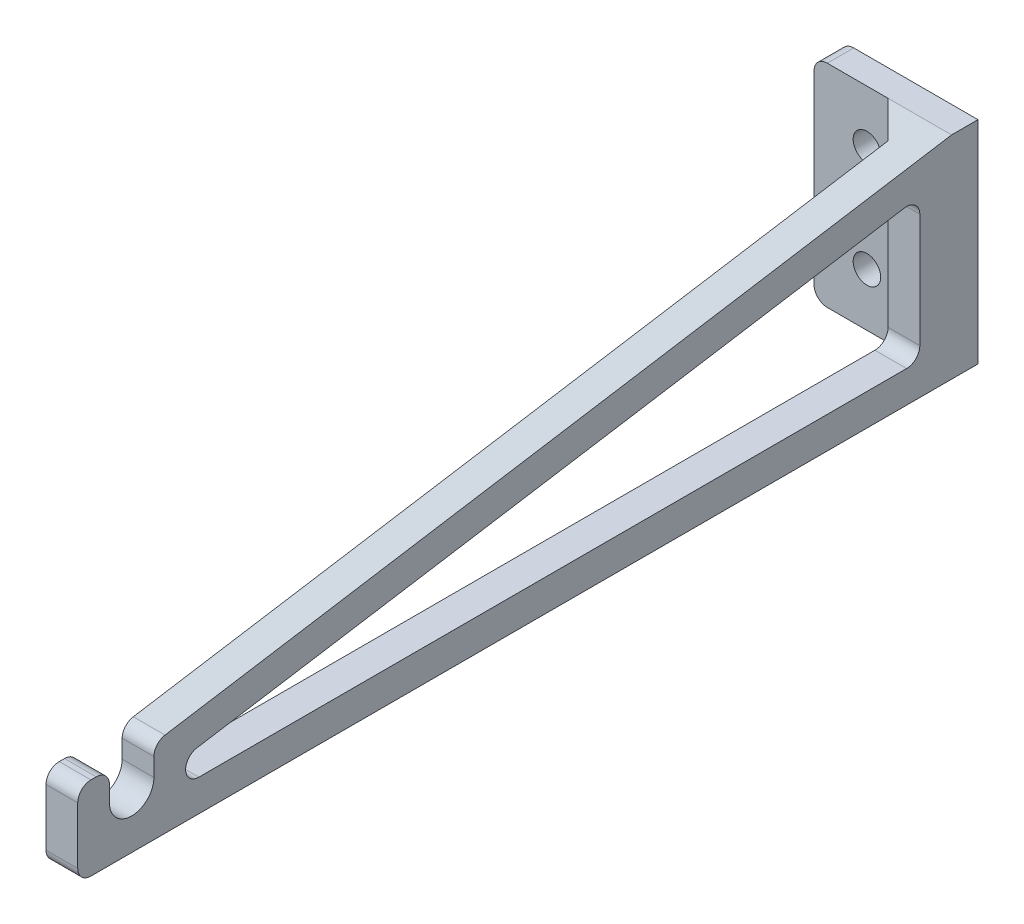
ISO-10303-21;
HEADER;
FILE_DESCRIPTION(('STEP AP214'),'2;1');
FILE_NAME('part.step','',(''),(''),'','','');
FILE_SCHEMA(('AUTOMOTIVE_DESIGN { 1 0 10303 214 1 1 1 1 }'));
ENDSEC;
DATA;
#1=APPLICATION_CONTEXT('core data for automotive mechanical design processes');
#2=APPLICATION_PROTOCOL_DEFINITION('international standard','automotive_design',2000,#1);
#3=PRODUCT_CONTEXT('',#1,'mechanical');
#4=PRODUCT('Part','Part','',(#3));
#5=PRODUCT_RELATED_PRODUCT_CATEGORY('part','',(#4));
#6=PRODUCT_DEFINITION_FORMATION('','',#4);
#7=PRODUCT_DEFINITION_CONTEXT('part definition',#1,'design');
#8=PRODUCT_DEFINITION('design','',#6,#7);
#9=PRODUCT_DEFINITION_SHAPE('','',#8);
#10=(LENGTH_UNIT() NAMED_UNIT(*) SI_UNIT(.MILLI.,.METRE.));
#11=(NAMED_UNIT(*) PLANE_ANGLE_UNIT() SI_UNIT($,.RADIAN.));
#12=(NAMED_UNIT(*) SI_UNIT($,.STERADIAN.) SOLID_ANGLE_UNIT());
#13=UNCERTAINTY_MEASURE_WITH_UNIT(LENGTH_MEASURE(1.E-05),#10,'distance_accuracy_value','');
#14=(GEOMETRIC_REPRESENTATION_CONTEXT(3) GLOBAL_UNCERTAINTY_ASSIGNED_CONTEXT((#13)) GLOBAL_UNIT_ASSIGNED_CONTEXT((#10,
#11,#12)) REPRESENTATION_CONTEXT('',''));
#15=CARTESIAN_POINT('',(0.,0.,0.));
#16=DIRECTION('',(0.,0.,1.));
#17=DIRECTION('',(1.,0.,0.));
#18=AXIS2_PLACEMENT_3D('',#15,#16,#17);
#19=CARTESIAN_POINT('',(-6.00000000000002,0.,5.));
#20=DIRECTION('',(-0.707106781186544,0.,0.707106781186551));
#21=DIRECTION('',(0.,1.,0.));
#22=AXIS2_PLACEMENT_3D('',#19,#20,#21);
#23=PLANE('',#22);
#24=CARTESIAN_POINT('',(-10.,10.,1.00000000000006));
#25=DIRECTION('',(0.707106781186544,0.,-0.707106781186551));
#26=DIRECTION('',(-0.707106781186551,0.,-0.707106781186544));
#27=AXIS2_PLACEMENT_3D('',#24,#25,#26);
#28=ELLIPSE('',#27,7.07106781186544,5.);
#29=CARTESIAN_POINT('',(-6.00000000000002,13.,5.));
#30=VERTEX_POINT('',#29);
#31=CARTESIAN_POINT('',(-6.00000000000002,6.99999999999998,5.));
#32=VERTEX_POINT('',#31);
#33=EDGE_CURVE('E11',#30,#32,#28,.T.);
#34=ORIENTED_EDGE('',*,*,#33,.T.);
#35=DIRECTION('',(0.,-1.,0.));
#36=VECTOR('',#35,1.);
#37=CARTESIAN_POINT('',(-6.00000000000002,0.,5.));
#38=LINE('',#37,#36);
#39=CARTESIAN_POINT('',(-6.00000000000002,0.,5.));
#40=VERTEX_POINT('',#39);
#41=EDGE_CURVE('E239',#32,#40,#38,.T.);
#42=ORIENTED_EDGE('',*,*,#41,.T.);
#43=DIRECTION('',(-0.707106781186551,0.,-0.707106781186544));
#44=VECTOR('',#43,1.);
#45=CARTESIAN_POINT('',(-2.99999999999998,0.,8.00000000000001));
#46=LINE('',#45,#44);
#47=CARTESIAN_POINT('',(0.,0.,11.));
#48=VERTEX_POINT('',#47);
#49=EDGE_CURVE('E608',#40,#48,#46,.F.);
#50=ORIENTED_EDGE('',*,*,#49,.T.);
#51=DIRECTION('',(0.,1.,0.));
#52=VECTOR('',#51,1.);
#53=CARTESIAN_POINT('',(0.,40.,11.));
#54=LINE('',#53,#52);
#55=CARTESIAN_POINT('',(0.,8.5,11.));
#56=VERTEX_POINT('',#55);
#57=EDGE_CURVE('E242',#48,#56,#54,.T.);
#58=ORIENTED_EDGE('',*,*,#57,.T.);
#59=DIRECTION('',(0.,-1.,0.));
#60=VECTOR('',#59,1.);
#61=CARTESIAN_POINT('',(0.,6.,11.));
#62=LINE('',#61,#60);
#63=CARTESIAN_POINT('',(0.,30.0239709974199,11.));
#64=VERTEX_POINT('',#63);
#65=EDGE_CURVE('E499',#64,#56,#62,.T.);
#66=ORIENTED_EDGE('',*,*,#65,.F.);
#67=DIRECTION('',(0.,1.,0.));
#68=VECTOR('',#67,1.);
#69=CARTESIAN_POINT('',(0.,40.,11.));
#70=LINE('',#69,#68);
#71=CARTESIAN_POINT('',(0.,39.035175879397,11.));
#72=VERTEX_POINT('',#71);
#73=EDGE_CURVE('E237',#64,#72,#70,.T.);
#74=ORIENTED_EDGE('',*,*,#73,.T.);
#75=DIRECTION('',(0.702579553550976,-0.112977616651412,0.702579553550968));
#76=VECTOR('',#75,1.);
#77=CARTESIAN_POINT('',(-0.0765836511853451,39.0474908383816,10.9234163488146));
#78=LINE('',#77,#76);
#79=CARTESIAN_POINT('',(-6.00000000000002,40.,5.));
#80=VERTEX_POINT('',#79);
#81=EDGE_CURVE('E233',#72,#80,#78,.F.);
#82=ORIENTED_EDGE('',*,*,#81,.T.);
#83=CARTESIAN_POINT('',(-6.00000000000002,33.,5.));
#84=VERTEX_POINT('',#83);
#85=EDGE_CURVE('E223',#80,#84,#38,.T.);
#86=ORIENTED_EDGE('',*,*,#85,.T.);
#87=CARTESIAN_POINT('',(-10.,30.,1.00000000000006));
#88=DIRECTION('',(0.707106781186544,0.,-0.707106781186551));
#89=DIRECTION('',(-0.707106781186551,0.,-0.707106781186544));
#90=AXIS2_PLACEMENT_3D('',#87,#88,#89);
#91=ELLIPSE('',#90,7.07106781186544,5.);
#92=CARTESIAN_POINT('',(-6.00000000000002,27.,5.));
#93=VERTEX_POINT('',#92);
#94=EDGE_CURVE('E46',#84,#93,#91,.T.);
#95=ORIENTED_EDGE('',*,*,#94,.T.);
#96=EDGE_CURVE('E226',#93,#30,#38,.T.);
#97=ORIENTED_EDGE('',*,*,#96,.T.);
#98=EDGE_LOOP('',(#34,#42,#50,#58,#66,#74,#82,#86,#95,#97));
#99=FACE_BOUND('',#98,.T.);
#100=ADVANCED_FACE('F38',(#99),#23,.T.);
#101=CARTESIAN_POINT('',(0.,0.,5.));
#102=DIRECTION('',(0.,1.,0.));
#103=DIRECTION('',(0.,0.,1.));
#104=AXIS2_PLACEMENT_3D('',#101,#102,#103);
#105=PLANE('',#104);
#106=DIRECTION('',(-1.,0.,0.));
#107=VECTOR('',#106,1.);
#108=CARTESIAN_POINT('',(0.,0.,0.));
#109=LINE('',#108,#107);
#110=CARTESIAN_POINT('',(6.,0.,0.));
#111=VERTEX_POINT('',#110);
#112=CARTESIAN_POINT('',(-17.5,0.,0.));
#113=VERTEX_POINT('',#112);
#114=EDGE_CURVE('E401',#111,#113,#109,.T.);
#115=ORIENTED_EDGE('',*,*,#114,.F.);
#116=DIRECTION('',(0.,0.,1.));
#117=VECTOR('',#116,1.);
#118=CARTESIAN_POINT('',(6.,0.,0.));
#119=LINE('',#118,#117);
#120=CARTESIAN_POINT('',(6.,0.,167.7));
#121=VERTEX_POINT('',#120);
#122=EDGE_CURVE('E428',#111,#121,#119,.T.);
#123=ORIENTED_EDGE('',*,*,#122,.T.);
#124=DIRECTION('',(-1.,0.,0.));
#125=VECTOR('',#124,1.);
#126=CARTESIAN_POINT('',(0.,0.,167.7));
#127=LINE('',#126,#125);
#128=CARTESIAN_POINT('',(0.,0.,167.7));
#129=VERTEX_POINT('',#128);
#130=EDGE_CURVE('E373',#129,#121,#127,.F.);
#131=ORIENTED_EDGE('',*,*,#130,.F.);
#132=DIRECTION('',(0.,0.,1.));
#133=VECTOR('',#132,1.);
#134=CARTESIAN_POINT('',(0.,0.,0.));
#135=LINE('',#134,#133);
#136=EDGE_CURVE('E449',#48,#129,#135,.T.);
#137=ORIENTED_EDGE('',*,*,#136,.F.);
#138=ORIENTED_EDGE('',*,*,#49,.F.);
#139=DIRECTION('',(-1.,0.,0.));
#140=VECTOR('',#139,1.);
#141=CARTESIAN_POINT('',(0.,0.,5.));
#142=LINE('',#141,#140);
#143=CARTESIAN_POINT('',(-17.5,0.,5.));
#144=VERTEX_POINT('',#143);
#145=EDGE_CURVE('E396',#40,#144,#142,.T.);
#146=ORIENTED_EDGE('',*,*,#145,.T.);
#147=DIRECTION('',(0.,0.,-1.));
#148=VECTOR('',#147,1.);
#149=CARTESIAN_POINT('',(-17.5,0.,5.));
#150=LINE('',#149,#148);
#151=EDGE_CURVE('E369',#113,#144,#150,.F.);
#152=ORIENTED_EDGE('',*,*,#151,.F.);
#153=EDGE_LOOP('',(#115,#123,#131,#137,#138,#146,#152));
#154=FACE_BOUND('',#153,.T.);
#155=ADVANCED_FACE('F567',(#154),#105,.F.);
#156=CARTESIAN_POINT('',(-20.,0.,5.));
#157=DIRECTION('',(1.,0.,0.));
#158=DIRECTION('',(0.,0.,1.));
#159=AXIS2_PLACEMENT_3D('',#156,#157,#158);
#160=PLANE('',#159);
#161=DIRECTION('',(0.,1.,0.));
#162=VECTOR('',#161,1.);
#163=CARTESIAN_POINT('',(-20.,0.,5.));
#164=LINE('',#163,#162);
#165=CARTESIAN_POINT('',(-20.,2.5,5.));
#166=VERTEX_POINT('',#165);
#167=CARTESIAN_POINT('',(-20.,37.5,5.));
#168=VERTEX_POINT('',#167);
#169=EDGE_CURVE('E409',#166,#168,#164,.T.);
#170=ORIENTED_EDGE('',*,*,#169,.T.);
#171=DIRECTION('',(0.,0.,-1.));
#172=VECTOR('',#171,1.);
#173=CARTESIAN_POINT('',(-20.,37.5,5.));
#174=LINE('',#173,#172);
#175=CARTESIAN_POINT('',(-20.,37.5,0.));
#176=VERTEX_POINT('',#175);
#177=EDGE_CURVE('E387',#176,#168,#174,.F.);
#178=ORIENTED_EDGE('',*,*,#177,.F.);
#179=DIRECTION('',(0.,1.,0.));
#180=VECTOR('',#179,1.);
#181=CARTESIAN_POINT('',(-20.,0.,0.));
#182=LINE('',#181,#180);
#183=CARTESIAN_POINT('',(-20.,2.5,0.));
#184=VERTEX_POINT('',#183);
#185=EDGE_CURVE('E397',#184,#176,#182,.T.);
#186=ORIENTED_EDGE('',*,*,#185,.F.);
#187=DIRECTION('',(0.,0.,-1.));
#188=VECTOR('',#187,1.);
#189=CARTESIAN_POINT('',(-20.,2.5,5.));
#190=LINE('',#189,#188);
#191=EDGE_CURVE('E383',#166,#184,#190,.T.);
#192=ORIENTED_EDGE('',*,*,#191,.F.);
#193=EDGE_LOOP('',(#170,#178,#186,#192));
#194=FACE_BOUND('',#193,.T.);
#195=ADVANCED_FACE('F549',(#194),#160,.F.);
#196=CARTESIAN_POINT('',(0.,40.,5.));
#197=DIRECTION('',(0.,-1.,0.));
#198=DIRECTION('',(0.,0.,-1.));
#199=AXIS2_PLACEMENT_3D('',#196,#197,#198);
#200=PLANE('',#199);
#201=DIRECTION('',(1.,0.,0.));
#202=VECTOR('',#201,1.);
#203=CARTESIAN_POINT('',(0.,40.,5.));
#204=LINE('',#203,#202);
#205=CARTESIAN_POINT('',(-17.5,40.,5.));
#206=VERTEX_POINT('',#205);
#207=EDGE_CURVE('E391',#206,#80,#204,.T.);
#208=ORIENTED_EDGE('',*,*,#207,.T.);
#209=DIRECTION('',(-1.,0.,0.));
#210=VECTOR('',#209,1.);
#211=CARTESIAN_POINT('',(6.,40.,5.));
#212=LINE('',#211,#210);
#213=CARTESIAN_POINT('',(6.,40.,5.));
#214=VERTEX_POINT('',#213);
#215=EDGE_CURVE('E421',#214,#80,#212,.T.);
#216=ORIENTED_EDGE('',*,*,#215,.F.);
#217=DIRECTION('',(0.,0.,-1.));
#218=VECTOR('',#217,1.);
#219=CARTESIAN_POINT('',(6.,40.,5.));
#220=LINE('',#219,#218);
#221=CARTESIAN_POINT('',(6.,40.,0.));
#222=VERTEX_POINT('',#221);
#223=EDGE_CURVE('E456',#214,#222,#220,.T.);
#224=ORIENTED_EDGE('',*,*,#223,.T.);
#225=DIRECTION('',(1.,0.,0.));
#226=VECTOR('',#225,1.);
#227=CARTESIAN_POINT('',(0.,40.,0.));
#228=LINE('',#227,#226);
#229=CARTESIAN_POINT('',(-17.5,40.,0.));
#230=VERTEX_POINT('',#229);
#231=EDGE_CURVE('E392',#230,#222,#228,.T.);
#232=ORIENTED_EDGE('',*,*,#231,.F.);
#233=DIRECTION('',(0.,0.,-1.));
#234=VECTOR('',#233,1.);
#235=CARTESIAN_POINT('',(-17.5,40.,5.));
#236=LINE('',#235,#234);
#237=EDGE_CURVE('E283',#206,#230,#236,.T.);
#238=ORIENTED_EDGE('',*,*,#237,.F.);
#239=EDGE_LOOP('',(#208,#216,#224,#232,#238));
#240=FACE_BOUND('',#239,.T.);
#241=ADVANCED_FACE('F556',(#240),#200,.F.);
#242=CARTESIAN_POINT('',(0.,0.,5.));
#243=DIRECTION('',(0.,0.,-1.));
#244=DIRECTION('',(1.,0.,0.));
#245=AXIS2_PLACEMENT_3D('',#242,#243,#244);
#246=PLANE('',#245);
#247=ORIENTED_EDGE('',*,*,#96,.F.);
#248=CARTESIAN_POINT('',(-10.,30.,5.));
#249=DIRECTION('',(0.,0.,-1.));
#250=DIRECTION('',(-1.,0.,0.));
#251=AXIS2_PLACEMENT_3D('',#248,#249,#250);
#252=CIRCLE('',#251,5.);
#253=EDGE_CURVE('E59',#84,#93,#252,.T.);
#254=ORIENTED_EDGE('',*,*,#253,.F.);
#255=ORIENTED_EDGE('',*,*,#85,.F.);
#256=ORIENTED_EDGE('',*,*,#207,.F.);
#257=CARTESIAN_POINT('',(-17.5,37.5,5.));
#258=DIRECTION('',(0.,0.,1.));
#259=DIRECTION('',(1.,0.,0.));
#260=AXIS2_PLACEMENT_3D('',#257,#258,#259);
#261=CIRCLE('',#260,2.5);
#262=EDGE_CURVE('E366',#168,#206,#261,.F.);
#263=ORIENTED_EDGE('',*,*,#262,.F.);
#264=ORIENTED_EDGE('',*,*,#169,.F.);
#265=CARTESIAN_POINT('',(-17.5,2.5,5.));
#266=DIRECTION('',(0.,0.,1.));
#267=DIRECTION('',(1.,0.,0.));
#268=AXIS2_PLACEMENT_3D('',#265,#266,#267);
#269=CIRCLE('',#268,2.5);
#270=EDGE_CURVE('E363',#144,#166,#269,.F.);
#271=ORIENTED_EDGE('',*,*,#270,.F.);
#272=ORIENTED_EDGE('',*,*,#145,.F.);
#273=ORIENTED_EDGE('',*,*,#41,.F.);
#274=CARTESIAN_POINT('',(-10.,10.,5.));
#275=DIRECTION('',(0.,0.,-1.));
#276=DIRECTION('',(-1.,0.,0.));
#277=AXIS2_PLACEMENT_3D('',#274,#275,#276);
#278=CIRCLE('',#277,5.);
#279=EDGE_CURVE('E52',#30,#32,#278,.T.);
#280=ORIENTED_EDGE('',*,*,#279,.F.);
#281=EDGE_LOOP('',(#247,#254,#255,#256,#263,#264,#271,#272,#273,#280));
#282=FACE_BOUND('',#281,.T.);
#283=CARTESIAN_POINT('',(-10.,30.,5.));
#284=DIRECTION('',(0.,0.,-1.));
#285=DIRECTION('',(-1.,0.,0.));
#286=AXIS2_PLACEMENT_3D('',#283,#284,#285);
#287=CIRCLE('',#286,2.6);
#288=CARTESIAN_POINT('',(-12.6,30.,5.));
#289=VERTEX_POINT('',#288);
#290=EDGE_CURVE('E525',#289,#289,#287,.T.);
#291=ORIENTED_EDGE('',*,*,#290,.T.);
#292=EDGE_LOOP('',(#291));
#293=FACE_BOUND('',#292,.T.);
#294=CARTESIAN_POINT('',(-10.,10.,5.));
#295=DIRECTION('',(0.,0.,-1.));
#296=DIRECTION('',(-1.,0.,0.));
#297=AXIS2_PLACEMENT_3D('',#294,#295,#296);
#298=CIRCLE('',#297,2.6);
#299=CARTESIAN_POINT('',(-12.6,10.,5.));
#300=VERTEX_POINT('',#299);
#301=EDGE_CURVE('E517',#300,#300,#298,.T.);
#302=ORIENTED_EDGE('',*,*,#301,.T.);
#303=EDGE_LOOP('',(#302));
#304=FACE_BOUND('',#303,.T.);
#305=ADVANCED_FACE('F219',(#282,#293,#304),#246,.F.);
#306=CARTESIAN_POINT('',(0.,0.,0.));
#307=DIRECTION('',(0.,0.,-1.));
#308=DIRECTION('',(1.,0.,0.));
#309=AXIS2_PLACEMENT_3D('',#306,#307,#308);
#310=PLANE('',#309);
#311=CARTESIAN_POINT('',(-10.,30.,0.));
#312=DIRECTION('',(0.,0.,-1.));
#313=DIRECTION('',(-1.,0.,0.));
#314=AXIS2_PLACEMENT_3D('',#311,#312,#313);
#315=CIRCLE('',#314,2.6);
#316=CARTESIAN_POINT('',(-12.6,30.,0.));
#317=VERTEX_POINT('',#316);
#318=EDGE_CURVE('E503',#317,#317,#315,.T.);
#319=ORIENTED_EDGE('',*,*,#318,.F.);
#320=EDGE_LOOP('',(#319));
#321=FACE_BOUND('',#320,.T.);
#322=CARTESIAN_POINT('',(-10.,10.,0.));
#323=DIRECTION('',(0.,0.,-1.));
#324=DIRECTION('',(-1.,0.,0.));
#325=AXIS2_PLACEMENT_3D('',#322,#323,#324);
#326=CIRCLE('',#325,2.6);
#327=CARTESIAN_POINT('',(-12.6,10.,0.));
#328=VERTEX_POINT('',#327);
#329=EDGE_CURVE('E521',#328,#328,#326,.T.);
#330=ORIENTED_EDGE('',*,*,#329,.F.);
#331=EDGE_LOOP('',(#330));
#332=FACE_BOUND('',#331,.T.);
#333=ORIENTED_EDGE('',*,*,#185,.T.);
#334=CARTESIAN_POINT('',(-17.5,37.5,0.));
#335=DIRECTION('',(0.,0.,1.));
#336=DIRECTION('',(1.,0.,0.));
#337=AXIS2_PLACEMENT_3D('',#334,#335,#336);
#338=CIRCLE('',#337,2.5);
#339=EDGE_CURVE('E380',#230,#176,#338,.T.);
#340=ORIENTED_EDGE('',*,*,#339,.F.);
#341=ORIENTED_EDGE('',*,*,#231,.T.);
#342=DIRECTION('',(0.,-1.,0.));
#343=VECTOR('',#342,1.);
#344=CARTESIAN_POINT('',(6.,40.,0.));
#345=LINE('',#344,#343);
#346=EDGE_CURVE('E424',#222,#111,#345,.T.);
#347=ORIENTED_EDGE('',*,*,#346,.T.);
#348=ORIENTED_EDGE('',*,*,#114,.T.);
#349=CARTESIAN_POINT('',(-17.5,2.5,0.));
#350=DIRECTION('',(0.,0.,1.));
#351=DIRECTION('',(1.,0.,0.));
#352=AXIS2_PLACEMENT_3D('',#349,#350,#351);
#353=CIRCLE('',#352,2.5);
#354=EDGE_CURVE('E377',#184,#113,#353,.T.);
#355=ORIENTED_EDGE('',*,*,#354,.F.);
#356=EDGE_LOOP('',(#333,#340,#341,#347,#348,#355));
#357=FACE_BOUND('',#356,.T.);
#358=ADVANCED_FACE('F538',(#321,#332,#357),#310,.T.);
#359=CARTESIAN_POINT('',(6.,10.2,160.));
#360=DIRECTION('',(1.,0.,0.));
#361=DIRECTION('',(0.,0.,1.));
#362=AXIS2_PLACEMENT_3D('',#359,#360,#361);
#363=PLANE('',#362);
#364=DIRECTION('',(0.,1.,0.));
#365=VECTOR('',#364,1.);
#366=CARTESIAN_POINT('',(6.,15.7507537688442,170.2));
#367=LINE('',#366,#365);
#368=CARTESIAN_POINT('',(6.,2.50000000000001,170.2));
#369=VERTEX_POINT('',#368);
#370=CARTESIAN_POINT('',(6.,13.2507537688442,170.2));
#371=VERTEX_POINT('',#370);
#372=EDGE_CURVE('E479',#369,#371,#367,.T.);
#373=ORIENTED_EDGE('',*,*,#372,.F.);
#374=CARTESIAN_POINT('',(6.,2.5,167.7));
#375=DIRECTION('',(-1.,0.,0.));
#376=DIRECTION('',(0.,0.,1.));
#377=AXIS2_PLACEMENT_3D('',#374,#375,#376);
#378=CIRCLE('',#377,2.5);
#379=EDGE_CURVE('E332',#121,#369,#378,.T.);
#380=ORIENTED_EDGE('',*,*,#379,.F.);
#381=ORIENTED_EDGE('',*,*,#122,.F.);
#382=ORIENTED_EDGE('',*,*,#346,.F.);
#383=ORIENTED_EDGE('',*,*,#223,.F.);
#384=DIRECTION('',(0.,0.158764460274187,-0.987316487330099));
#385=VECTOR('',#384,1.);
#386=CARTESIAN_POINT('',(6.,40.,5.));
#387=LINE('',#386,#385);
#388=CARTESIAN_POINT('',(6.,16.0889389104425,153.696911150685));
#389=VERTEX_POINT('',#388);
#390=EDGE_CURVE('E460',#389,#214,#387,.T.);
#391=ORIENTED_EDGE('',*,*,#390,.F.);
#392=CARTESIAN_POINT('',(6.,13.6206476921173,153.3));
#393=DIRECTION('',(-1.,0.,0.));
#394=DIRECTION('',(0.,0.,1.));
#395=AXIS2_PLACEMENT_3D('',#392,#393,#394);
#396=CIRCLE('',#395,2.5);
#397=CARTESIAN_POINT('',(6.,13.6206476921173,155.8));
#398=VERTEX_POINT('',#397);
#399=EDGE_CURVE('E328',#398,#389,#396,.T.);
#400=ORIENTED_EDGE('',*,*,#399,.F.);
#401=DIRECTION('',(0.,1.,0.));
#402=VECTOR('',#401,1.);
#403=CARTESIAN_POINT('',(6.,10.2,155.8));
#404=LINE('',#403,#402);
#405=CARTESIAN_POINT('',(6.,10.2,155.8));
#406=VERTEX_POINT('',#405);
#407=EDGE_CURVE('E463',#406,#398,#404,.T.);
#408=ORIENTED_EDGE('',*,*,#407,.F.);
#409=CARTESIAN_POINT('',(6.,10.2,160.));
#410=DIRECTION('',(1.,0.,0.));
#411=DIRECTION('',(0.,0.,1.));
#412=AXIS2_PLACEMENT_3D('',#409,#410,#411);
#413=CIRCLE('',#412,4.20000000000001);
#414=CARTESIAN_POINT('',(6.,10.2,164.2));
#415=VERTEX_POINT('',#414);
#416=EDGE_CURVE('E467',#415,#406,#413,.T.);
#417=ORIENTED_EDGE('',*,*,#416,.F.);
#418=DIRECTION('',(0.,-1.,0.));
#419=VECTOR('',#418,1.);
#420=CARTESIAN_POINT('',(6.,10.2,164.2));
#421=LINE('',#420,#419);
#422=CARTESIAN_POINT('',(6.,13.2507537688442,164.2));
#423=VERTEX_POINT('',#422);
#424=EDGE_CURVE('E471',#423,#415,#421,.T.);
#425=ORIENTED_EDGE('',*,*,#424,.F.);
#426=CARTESIAN_POINT('',(6.,13.2507537688442,166.7));
#427=DIRECTION('',(-1.,0.,0.));
#428=DIRECTION('',(0.,0.,1.));
#429=AXIS2_PLACEMENT_3D('',#426,#427,#428);
#430=CIRCLE('',#429,2.5);
#431=CARTESIAN_POINT('',(6.,15.7507537688442,166.7));
#432=VERTEX_POINT('',#431);
#433=EDGE_CURVE('E324',#432,#423,#430,.T.);
#434=ORIENTED_EDGE('',*,*,#433,.F.);
#435=DIRECTION('',(0.,0.,-1.));
#436=VECTOR('',#435,1.);
#437=CARTESIAN_POINT('',(6.,15.7507537688442,164.2));
#438=LINE('',#437,#436);
#439=CARTESIAN_POINT('',(6.,15.7507537688442,167.7));
#440=VERTEX_POINT('',#439);
#441=EDGE_CURVE('E475',#440,#432,#438,.T.);
#442=ORIENTED_EDGE('',*,*,#441,.F.);
#443=CARTESIAN_POINT('',(6.,13.2507537688442,167.7));
#444=DIRECTION('',(-1.,0.,0.));
#445=DIRECTION('',(0.,0.,1.));
#446=AXIS2_PLACEMENT_3D('',#443,#444,#445);
#447=CIRCLE('',#446,2.5);
#448=EDGE_CURVE('E320',#371,#440,#447,.T.);
#449=ORIENTED_EDGE('',*,*,#448,.F.);
#450=EDGE_LOOP('',(#373,#380,#381,#382,#383,#391,#400,#408,#417,#425,#434,#442,#449));
#451=FACE_BOUND('',#450,.T.);
#452=DIRECTION('',(0.,0.,1.));
#453=VECTOR('',#452,1.);
#454=CARTESIAN_POINT('',(6.,6.,11.));
#455=LINE('',#454,#453);
#456=CARTESIAN_POINT('',(6.,6.,13.5));
#457=VERTEX_POINT('',#456);
#458=CARTESIAN_POINT('',(6.,6.,147.3));
#459=VERTEX_POINT('',#458);
#460=EDGE_CURVE('E510',#457,#459,#455,.T.);
#461=ORIENTED_EDGE('',*,*,#460,.T.);
#462=CARTESIAN_POINT('',(6.,8.5,147.3));
#463=DIRECTION('',(-1.,0.,0.));
#464=DIRECTION('',(0.,0.,1.));
#465=AXIS2_PLACEMENT_3D('',#462,#463,#464);
#466=CIRCLE('',#465,2.5);
#467=CARTESIAN_POINT('',(6.,8.5,149.8));
#468=VERTEX_POINT('',#467);
#469=EDGE_CURVE('E257',#468,#459,#466,.F.);
#470=ORIENTED_EDGE('',*,*,#469,.F.);
#471=DIRECTION('',(0.,1.,0.));
#472=VECTOR('',#471,1.);
#473=CARTESIAN_POINT('',(6.,6.,149.8));
#474=LINE('',#473,#472);
#475=CARTESIAN_POINT('',(6.,8.50839310797267,149.8));
#476=VERTEX_POINT('',#475);
#477=EDGE_CURVE('E507',#468,#476,#474,.T.);
#478=ORIENTED_EDGE('',*,*,#477,.T.);
#479=CARTESIAN_POINT('',(6.,8.50839310797267,147.3));
#480=DIRECTION('',(-1.,0.,0.));
#481=DIRECTION('',(0.,0.,1.));
#482=AXIS2_PLACEMENT_3D('',#479,#480,#481);
#483=CIRCLE('',#482,2.5);
#484=CARTESIAN_POINT('',(6.,10.9766843262979,147.696911150685));
#485=VERTEX_POINT('',#484);
#486=EDGE_CURVE('E247',#485,#476,#483,.F.);
#487=ORIENTED_EDGE('',*,*,#486,.F.);
#488=DIRECTION('',(0.,0.158764460274187,-0.987316487330099));
#489=VECTOR('',#488,1.);
#490=CARTESIAN_POINT('',(6.,10.6384991846996,149.8));
#491=LINE('',#490,#489);
#492=CARTESIAN_POINT('',(6.,32.4922622157451,13.8969111506855));
#493=VERTEX_POINT('',#492);
#494=EDGE_CURVE('E453',#485,#493,#491,.T.);
#495=ORIENTED_EDGE('',*,*,#494,.T.);
#496=CARTESIAN_POINT('',(6.,30.0239709974199,13.5));
#497=DIRECTION('',(-1.,0.,0.));
#498=DIRECTION('',(0.,0.,1.));
#499=AXIS2_PLACEMENT_3D('',#496,#497,#498);
#500=CIRCLE('',#499,2.5);
#501=CARTESIAN_POINT('',(6.,30.0239709974199,11.));
#502=VERTEX_POINT('',#501);
#503=EDGE_CURVE('E275',#502,#493,#500,.F.);
#504=ORIENTED_EDGE('',*,*,#503,.F.);
#505=DIRECTION('',(0.,-1.,0.));
#506=VECTOR('',#505,1.);
#507=CARTESIAN_POINT('',(6.,6.,11.));
#508=LINE('',#507,#506);
#509=CARTESIAN_POINT('',(6.,8.5,11.));
#510=VERTEX_POINT('',#509);
#511=EDGE_CURVE('E490',#502,#510,#508,.T.);
#512=ORIENTED_EDGE('',*,*,#511,.T.);
#513=CARTESIAN_POINT('',(6.,8.5,13.5));
#514=DIRECTION('',(-1.,0.,0.));
#515=DIRECTION('',(0.,0.,1.));
#516=AXIS2_PLACEMENT_3D('',#513,#514,#515);
#517=CIRCLE('',#516,2.5);
#518=EDGE_CURVE('E267',#457,#510,#517,.F.);
#519=ORIENTED_EDGE('',*,*,#518,.F.);
#520=EDGE_LOOP('',(#461,#470,#478,#487,#495,#504,#512,#519));
#521=FACE_BOUND('',#520,.T.);
#522=ADVANCED_FACE('F541',(#451,#521),#363,.T.);
#523=CARTESIAN_POINT('',(0.,10.2,160.));
#524=DIRECTION('',(1.,0.,0.));
#525=DIRECTION('',(0.,0.,1.));
#526=AXIS2_PLACEMENT_3D('',#523,#524,#525);
#527=PLANE('',#526);
#528=ORIENTED_EDGE('',*,*,#136,.T.);
#529=CARTESIAN_POINT('',(0.,2.5,167.7));
#530=DIRECTION('',(-1.,0.,0.));
#531=DIRECTION('',(0.,0.,1.));
#532=AXIS2_PLACEMENT_3D('',#529,#530,#531);
#533=CIRCLE('',#532,2.5);
#534=CARTESIAN_POINT('',(0.,2.50000000000001,170.2));
#535=VERTEX_POINT('',#534);
#536=EDGE_CURVE('E354',#535,#129,#533,.F.);
#537=ORIENTED_EDGE('',*,*,#536,.F.);
#538=DIRECTION('',(0.,1.,0.));
#539=VECTOR('',#538,1.);
#540=CARTESIAN_POINT('',(0.,15.7507537688442,170.2));
#541=LINE('',#540,#539);
#542=CARTESIAN_POINT('',(0.,13.2507537688442,170.2));
#543=VERTEX_POINT('',#542);
#544=EDGE_CURVE('E445',#535,#543,#541,.T.);
#545=ORIENTED_EDGE('',*,*,#544,.T.);
#546=CARTESIAN_POINT('',(0.,13.2507537688442,167.7));
#547=DIRECTION('',(-1.,0.,0.));
#548=DIRECTION('',(0.,0.,1.));
#549=AXIS2_PLACEMENT_3D('',#546,#547,#548);
#550=CIRCLE('',#549,2.5);
#551=CARTESIAN_POINT('',(0.,15.7507537688442,167.7));
#552=VERTEX_POINT('',#551);
#553=EDGE_CURVE('E342',#552,#543,#550,.F.);
#554=ORIENTED_EDGE('',*,*,#553,.F.);
#555=DIRECTION('',(0.,0.,-1.));
#556=VECTOR('',#555,1.);
#557=CARTESIAN_POINT('',(0.,15.7507537688442,164.2));
#558=LINE('',#557,#556);
#559=CARTESIAN_POINT('',(0.,15.7507537688442,166.7));
#560=VERTEX_POINT('',#559);
#561=EDGE_CURVE('E441',#552,#560,#558,.T.);
#562=ORIENTED_EDGE('',*,*,#561,.T.);
#563=CARTESIAN_POINT('',(0.,13.2507537688442,166.7));
#564=DIRECTION('',(-1.,0.,0.));
#565=DIRECTION('',(0.,0.,1.));
#566=AXIS2_PLACEMENT_3D('',#563,#564,#565);
#567=CIRCLE('',#566,2.5);
#568=CARTESIAN_POINT('',(0.,13.2507537688442,164.2));
#569=VERTEX_POINT('',#568);
#570=EDGE_CURVE('E346',#569,#560,#567,.F.);
#571=ORIENTED_EDGE('',*,*,#570,.F.);
#572=DIRECTION('',(0.,-1.,0.));
#573=VECTOR('',#572,1.);
#574=CARTESIAN_POINT('',(0.,10.2,164.2));
#575=LINE('',#574,#573);
#576=CARTESIAN_POINT('',(0.,10.2,164.2));
#577=VERTEX_POINT('',#576);
#578=EDGE_CURVE('E437',#569,#577,#575,.T.);
#579=ORIENTED_EDGE('',*,*,#578,.T.);
#580=CARTESIAN_POINT('',(0.,10.2,160.));
#581=DIRECTION('',(1.,0.,0.));
#582=DIRECTION('',(0.,0.,1.));
#583=AXIS2_PLACEMENT_3D('',#580,#581,#582);
#584=CIRCLE('',#583,4.20000000000001);
#585=CARTESIAN_POINT('',(0.,10.2,155.8));
#586=VERTEX_POINT('',#585);
#587=EDGE_CURVE('E433',#577,#586,#584,.T.);
#588=ORIENTED_EDGE('',*,*,#587,.T.);
#589=DIRECTION('',(0.,1.,0.));
#590=VECTOR('',#589,1.);
#591=CARTESIAN_POINT('',(0.,10.2,155.8));
#592=LINE('',#591,#590);
#593=CARTESIAN_POINT('',(0.,13.6206476921173,155.8));
#594=VERTEX_POINT('',#593);
#595=EDGE_CURVE('E429',#586,#594,#592,.T.);
#596=ORIENTED_EDGE('',*,*,#595,.T.);
#597=CARTESIAN_POINT('',(0.,13.6206476921173,153.3));
#598=DIRECTION('',(-1.,0.,0.));
#599=DIRECTION('',(0.,0.,1.));
#600=AXIS2_PLACEMENT_3D('',#597,#598,#599);
#601=CIRCLE('',#600,2.5);
#602=CARTESIAN_POINT('',(0.,16.0889389104425,153.696911150685));
#603=VERTEX_POINT('',#602);
#604=EDGE_CURVE('E350',#603,#594,#601,.F.);
#605=ORIENTED_EDGE('',*,*,#604,.F.);
#606=DIRECTION('',(0.,0.158764460274187,-0.987316487330099));
#607=VECTOR('',#606,1.);
#608=CARTESIAN_POINT('',(0.,40.,5.));
#609=LINE('',#608,#607);
#610=EDGE_CURVE('E425',#603,#72,#609,.T.);
#611=ORIENTED_EDGE('',*,*,#610,.T.);
#612=ORIENTED_EDGE('',*,*,#73,.F.);
#613=CARTESIAN_POINT('',(0.,30.0239709974199,13.5));
#614=DIRECTION('',(-1.,0.,0.));
#615=DIRECTION('',(0.,0.,1.));
#616=AXIS2_PLACEMENT_3D('',#613,#614,#615);
#617=CIRCLE('',#616,2.5);
#618=CARTESIAN_POINT('',(0.,32.4922622157451,13.8969111506855));
#619=VERTEX_POINT('',#618);
#620=EDGE_CURVE('E279',#619,#64,#617,.T.);
#621=ORIENTED_EDGE('',*,*,#620,.F.);
#622=DIRECTION('',(0.,0.158764460274187,-0.987316487330099));
#623=VECTOR('',#622,1.);
#624=CARTESIAN_POINT('',(0.,10.6384991846996,149.8));
#625=LINE('',#624,#623);
#626=CARTESIAN_POINT('',(0.,10.9766843262979,147.696911150685));
#627=VERTEX_POINT('',#626);
#628=EDGE_CURVE('E486',#627,#619,#625,.T.);
#629=ORIENTED_EDGE('',*,*,#628,.F.);
#630=CARTESIAN_POINT('',(0.,8.50839310797267,147.3));
#631=DIRECTION('',(-1.,0.,0.));
#632=DIRECTION('',(0.,0.,1.));
#633=AXIS2_PLACEMENT_3D('',#630,#631,#632);
#634=CIRCLE('',#633,2.5);
#635=CARTESIAN_POINT('',(0.,8.50839310797267,149.8));
#636=VERTEX_POINT('',#635);
#637=EDGE_CURVE('E251',#636,#627,#634,.T.);
#638=ORIENTED_EDGE('',*,*,#637,.F.);
#639=DIRECTION('',(0.,1.,0.));
#640=VECTOR('',#639,1.);
#641=CARTESIAN_POINT('',(0.,6.,149.8));
#642=LINE('',#641,#640);
#643=CARTESIAN_POINT('',(0.,8.5,149.8));
#644=VERTEX_POINT('',#643);
#645=EDGE_CURVE('E491',#644,#636,#642,.T.);
#646=ORIENTED_EDGE('',*,*,#645,.F.);
#647=CARTESIAN_POINT('',(0.,8.5,147.3));
#648=DIRECTION('',(-1.,0.,0.));
#649=DIRECTION('',(0.,0.,1.));
#650=AXIS2_PLACEMENT_3D('',#647,#648,#649);
#651=CIRCLE('',#650,2.5);
#652=CARTESIAN_POINT('',(0.,6.,147.3));
#653=VERTEX_POINT('',#652);
#654=EDGE_CURVE('E263',#653,#644,#651,.T.);
#655=ORIENTED_EDGE('',*,*,#654,.F.);
#656=DIRECTION('',(0.,0.,1.));
#657=VECTOR('',#656,1.);
#658=CARTESIAN_POINT('',(0.,6.,11.));
#659=LINE('',#658,#657);
#660=CARTESIAN_POINT('',(0.,6.,13.5));
#661=VERTEX_POINT('',#660);
#662=EDGE_CURVE('E495',#661,#653,#659,.T.);
#663=ORIENTED_EDGE('',*,*,#662,.F.);
#664=CARTESIAN_POINT('',(0.,8.5,13.5));
#665=DIRECTION('',(-1.,0.,0.));
#666=DIRECTION('',(0.,0.,1.));
#667=AXIS2_PLACEMENT_3D('',#664,#665,#666);
#668=CIRCLE('',#667,2.5);
#669=EDGE_CURVE('E271',#56,#661,#668,.T.);
#670=ORIENTED_EDGE('',*,*,#669,.F.);
#671=ORIENTED_EDGE('',*,*,#57,.F.);
#672=EDGE_LOOP('',(#528,#537,#545,#554,#562,#571,#579,#588,#596,#605,#611,#612,#621,#629,#638,
#646,#655,#663,#670,#671));
#673=FACE_BOUND('',#672,.T.);
#674=ADVANCED_FACE('F612',(#673),#527,.F.);
#675=CARTESIAN_POINT('',(6.,15.7507537688442,170.2));
#676=DIRECTION('',(0.,0.,-1.));
#677=DIRECTION('',(0.,1.,0.));
#678=AXIS2_PLACEMENT_3D('',#675,#676,#677);
#679=PLANE('',#678);
#680=ORIENTED_EDGE('',*,*,#544,.F.);
#681=DIRECTION('',(-1.,0.,0.));
#682=VECTOR('',#681,1.);
#683=CARTESIAN_POINT('',(6.,2.50000000000001,170.2));
#684=LINE('',#683,#682);
#685=EDGE_CURVE('E339',#369,#535,#684,.T.);
#686=ORIENTED_EDGE('',*,*,#685,.F.);
#687=ORIENTED_EDGE('',*,*,#372,.T.);
#688=DIRECTION('',(-1.,0.,0.));
#689=VECTOR('',#688,1.);
#690=CARTESIAN_POINT('',(6.,13.2507537688442,170.2));
#691=LINE('',#690,#689);
#692=EDGE_CURVE('E336',#543,#371,#691,.F.);
#693=ORIENTED_EDGE('',*,*,#692,.F.);
#694=EDGE_LOOP('',(#680,#686,#687,#693));
#695=FACE_BOUND('',#694,.T.);
#696=ADVANCED_FACE('F603',(#695),#679,.F.);
#697=CARTESIAN_POINT('',(6.,15.7507537688442,164.2));
#698=DIRECTION('',(0.,-1.,0.));
#699=DIRECTION('',(0.,0.,-1.));
#700=AXIS2_PLACEMENT_3D('',#697,#698,#699);
#701=PLANE('',#700);
#702=ORIENTED_EDGE('',*,*,#441,.T.);
#703=DIRECTION('',(-1.,0.,0.));
#704=VECTOR('',#703,1.);
#705=CARTESIAN_POINT('',(6.,15.7507537688442,166.7));
#706=LINE('',#705,#704);
#707=EDGE_CURVE('E360',#560,#432,#706,.F.);
#708=ORIENTED_EDGE('',*,*,#707,.F.);
#709=ORIENTED_EDGE('',*,*,#561,.F.);
#710=DIRECTION('',(-1.,0.,0.));
#711=VECTOR('',#710,1.);
#712=CARTESIAN_POINT('',(6.,15.7507537688442,167.7));
#713=LINE('',#712,#711);
#714=EDGE_CURVE('E357',#440,#552,#713,.T.);
#715=ORIENTED_EDGE('',*,*,#714,.F.);
#716=EDGE_LOOP('',(#702,#708,#709,#715));
#717=FACE_BOUND('',#716,.T.);
#718=ADVANCED_FACE('F598',(#717),#701,.F.);
#719=CARTESIAN_POINT('',(6.,10.2,164.2));
#720=DIRECTION('',(0.,0.,1.));
#721=DIRECTION('',(-1.,0.,0.));
#722=AXIS2_PLACEMENT_3D('',#719,#720,#721);
#723=PLANE('',#722);
#724=ORIENTED_EDGE('',*,*,#424,.T.);
#725=DIRECTION('',(-1.,0.,0.));
#726=VECTOR('',#725,1.);
#727=CARTESIAN_POINT('',(6.,10.2,164.2));
#728=LINE('',#727,#726);
#729=EDGE_CURVE('E405',#415,#577,#728,.T.);
#730=ORIENTED_EDGE('',*,*,#729,.T.);
#731=ORIENTED_EDGE('',*,*,#578,.F.);
#732=DIRECTION('',(-1.,0.,0.));
#733=VECTOR('',#732,1.);
#734=CARTESIAN_POINT('',(6.,13.2507537688442,164.2));
#735=LINE('',#734,#733);
#736=EDGE_CURVE('E317',#423,#569,#735,.T.);
#737=ORIENTED_EDGE('',*,*,#736,.F.);
#738=EDGE_LOOP('',(#724,#730,#731,#737));
#739=FACE_BOUND('',#738,.T.);
#740=ADVANCED_FACE('F591',(#739),#723,.F.);
#741=CARTESIAN_POINT('',(6.,10.2,160.));
#742=DIRECTION('',(-1.,0.,0.));
#743=DIRECTION('',(0.,0.,-1.));
#744=AXIS2_PLACEMENT_3D('',#741,#742,#743);
#745=CYLINDRICAL_SURFACE('',#744,4.20000000000001);
#746=ORIENTED_EDGE('',*,*,#587,.F.);
#747=ORIENTED_EDGE('',*,*,#729,.F.);
#748=ORIENTED_EDGE('',*,*,#416,.T.);
#749=DIRECTION('',(-1.,0.,0.));
#750=VECTOR('',#749,1.);
#751=CARTESIAN_POINT('',(6.,10.2,155.8));
#752=LINE('',#751,#750);
#753=EDGE_CURVE('E418',#406,#586,#752,.T.);
#754=ORIENTED_EDGE('',*,*,#753,.T.);
#755=EDGE_LOOP('',(#746,#747,#748,#754));
#756=FACE_BOUND('',#755,.T.);
#757=ADVANCED_FACE('F586',(#756),#745,.F.);
#758=CARTESIAN_POINT('',(6.,10.2,155.8));
#759=DIRECTION('',(0.,0.,-1.));
#760=DIRECTION('',(1.,0.,0.));
#761=AXIS2_PLACEMENT_3D('',#758,#759,#760);
#762=PLANE('',#761);
#763=ORIENTED_EDGE('',*,*,#595,.F.);
#764=ORIENTED_EDGE('',*,*,#753,.F.);
#765=ORIENTED_EDGE('',*,*,#407,.T.);
#766=DIRECTION('',(-1.,0.,0.));
#767=VECTOR('',#766,1.);
#768=CARTESIAN_POINT('',(6.,13.6206476921173,155.8));
#769=LINE('',#768,#767);
#770=EDGE_CURVE('E311',#594,#398,#769,.F.);
#771=ORIENTED_EDGE('',*,*,#770,.F.);
#772=EDGE_LOOP('',(#763,#764,#765,#771));
#773=FACE_BOUND('',#772,.T.);
#774=ADVANCED_FACE('F583',(#773),#762,.F.);
#775=CARTESIAN_POINT('',(6.,40.,5.));
#776=DIRECTION('',(0.,-0.987316487330099,-0.158764460274187));
#777=DIRECTION('',(0.,0.158764460274187,-0.987316487330099));
#778=AXIS2_PLACEMENT_3D('',#775,#776,#777);
#779=PLANE('',#778);
#780=ORIENTED_EDGE('',*,*,#390,.T.);
#781=ORIENTED_EDGE('',*,*,#215,.T.);
#782=ORIENTED_EDGE('',*,*,#81,.F.);
#783=ORIENTED_EDGE('',*,*,#610,.F.);
#784=DIRECTION('',(-1.,0.,0.));
#785=VECTOR('',#784,1.);
#786=CARTESIAN_POINT('',(6.,16.0889389104425,153.696911150685));
#787=LINE('',#786,#785);
#788=EDGE_CURVE('E314',#389,#603,#787,.T.);
#789=ORIENTED_EDGE('',*,*,#788,.F.);
#790=EDGE_LOOP('',(#780,#781,#782,#783,#789));
#791=FACE_BOUND('',#790,.T.);
#792=ADVANCED_FACE('F572',(#791),#779,.F.);
#793=CARTESIAN_POINT('',(6.,6.,11.));
#794=DIRECTION('',(0.,0.,1.));
#795=DIRECTION('',(0.,-1.,0.));
#796=AXIS2_PLACEMENT_3D('',#793,#794,#795);
#797=PLANE('',#796);
#798=ORIENTED_EDGE('',*,*,#65,.T.);
#799=DIRECTION('',(-1.,0.,0.));
#800=VECTOR('',#799,1.);
#801=CARTESIAN_POINT('',(0.,8.5,11.));
#802=LINE('',#801,#800);
#803=EDGE_CURVE('E302',#510,#56,#802,.T.);
#804=ORIENTED_EDGE('',*,*,#803,.F.);
#805=ORIENTED_EDGE('',*,*,#511,.F.);
#806=DIRECTION('',(-1.,0.,0.));
#807=VECTOR('',#806,1.);
#808=CARTESIAN_POINT('',(6.,30.0239709974199,11.));
#809=LINE('',#808,#807);
#810=EDGE_CURVE('E299',#64,#502,#809,.F.);
#811=ORIENTED_EDGE('',*,*,#810,.F.);
#812=EDGE_LOOP('',(#798,#804,#805,#811));
#813=FACE_BOUND('',#812,.T.);
#814=ADVANCED_FACE('F623',(#813),#797,.T.);
#815=CARTESIAN_POINT('',(6.,6.,11.));
#816=DIRECTION('',(0.,1.,0.));
#817=DIRECTION('',(0.,0.,1.));
#818=AXIS2_PLACEMENT_3D('',#815,#816,#817);
#819=PLANE('',#818);
#820=ORIENTED_EDGE('',*,*,#662,.T.);
#821=DIRECTION('',(-1.,0.,0.));
#822=VECTOR('',#821,1.);
#823=CARTESIAN_POINT('',(0.,6.,147.3));
#824=LINE('',#823,#822);
#825=EDGE_CURVE('E296',#459,#653,#824,.T.);
#826=ORIENTED_EDGE('',*,*,#825,.F.);
#827=ORIENTED_EDGE('',*,*,#460,.F.);
#828=DIRECTION('',(-1.,0.,0.));
#829=VECTOR('',#828,1.);
#830=CARTESIAN_POINT('',(6.,6.,13.5));
#831=LINE('',#830,#829);
#832=EDGE_CURVE('E293',#661,#457,#831,.F.);
#833=ORIENTED_EDGE('',*,*,#832,.F.);
#834=EDGE_LOOP('',(#820,#826,#827,#833));
#835=FACE_BOUND('',#834,.T.);
#836=ADVANCED_FACE('F672',(#835),#819,.T.);
#837=CARTESIAN_POINT('',(6.,6.,149.8));
#838=DIRECTION('',(0.,0.,-1.));
#839=DIRECTION('',(1.,0.,0.));
#840=AXIS2_PLACEMENT_3D('',#837,#838,#839);
#841=PLANE('',#840);
#842=ORIENTED_EDGE('',*,*,#645,.T.);
#843=DIRECTION('',(-1.,0.,0.));
#844=VECTOR('',#843,1.);
#845=CARTESIAN_POINT('',(0.,8.50839310797267,149.8));
#846=LINE('',#845,#844);
#847=EDGE_CURVE('E290',#476,#636,#846,.T.);
#848=ORIENTED_EDGE('',*,*,#847,.F.);
#849=ORIENTED_EDGE('',*,*,#477,.F.);
#850=DIRECTION('',(-1.,0.,0.));
#851=VECTOR('',#850,1.);
#852=CARTESIAN_POINT('',(6.,8.5,149.8));
#853=LINE('',#852,#851);
#854=EDGE_CURVE('E287',#644,#468,#853,.F.);
#855=ORIENTED_EDGE('',*,*,#854,.F.);
#856=EDGE_LOOP('',(#842,#848,#849,#855));
#857=FACE_BOUND('',#856,.T.);
#858=ADVANCED_FACE('F675',(#857),#841,.T.);
#859=CARTESIAN_POINT('',(6.,10.6384991846996,149.8));
#860=DIRECTION('',(0.,-0.987316487330099,-0.158764460274187));
#861=DIRECTION('',(0.,0.158764460274187,-0.987316487330099));
#862=AXIS2_PLACEMENT_3D('',#859,#860,#861);
#863=PLANE('',#862);
#864=ORIENTED_EDGE('',*,*,#494,.F.);
#865=DIRECTION('',(-1.,0.,0.));
#866=VECTOR('',#865,1.);
#867=CARTESIAN_POINT('',(6.,10.9766843262979,147.696911150685));
#868=LINE('',#867,#866);
#869=EDGE_CURVE('E308',#627,#485,#868,.F.);
#870=ORIENTED_EDGE('',*,*,#869,.F.);
#871=ORIENTED_EDGE('',*,*,#628,.T.);
#872=DIRECTION('',(-1.,0.,0.));
#873=VECTOR('',#872,1.);
#874=CARTESIAN_POINT('',(0.,32.4922622157451,13.8969111506855));
#875=LINE('',#874,#873);
#876=EDGE_CURVE('E305',#493,#619,#875,.T.);
#877=ORIENTED_EDGE('',*,*,#876,.F.);
#878=EDGE_LOOP('',(#864,#870,#871,#877));
#879=FACE_BOUND('',#878,.T.);
#880=ADVANCED_FACE('F679',(#879),#863,.T.);
#881=CARTESIAN_POINT('',(-10.,10.,0.));
#882=DIRECTION('',(0.,0.,1.));
#883=DIRECTION('',(-1.,0.,0.));
#884=AXIS2_PLACEMENT_3D('',#881,#882,#883);
#885=CYLINDRICAL_SURFACE('',#884,2.6);
#886=ORIENTED_EDGE('',*,*,#329,.T.);
#887=EDGE_LOOP('',(#886));
#888=FACE_BOUND('',#887,.T.);
#889=ORIENTED_EDGE('',*,*,#301,.F.);
#890=EDGE_LOOP('',(#889));
#891=FACE_BOUND('',#890,.T.);
#892=ADVANCED_FACE('F683',(#888,#891),#885,.F.);
#893=CARTESIAN_POINT('',(-10.,30.,0.));
#894=DIRECTION('',(0.,0.,1.));
#895=DIRECTION('',(-1.,0.,0.));
#896=AXIS2_PLACEMENT_3D('',#893,#894,#895);
#897=CYLINDRICAL_SURFACE('',#896,2.6);
#898=ORIENTED_EDGE('',*,*,#318,.T.);
#899=EDGE_LOOP('',(#898));
#900=FACE_BOUND('',#899,.T.);
#901=ORIENTED_EDGE('',*,*,#290,.F.);
#902=EDGE_LOOP('',(#901));
#903=FACE_BOUND('',#902,.T.);
#904=ADVANCED_FACE('F535',(#900,#903),#897,.F.);
#905=CARTESIAN_POINT('',(-17.5,2.5,5.));
#906=DIRECTION('',(0.,0.,-1.));
#907=DIRECTION('',(1.,0.,0.));
#908=AXIS2_PLACEMENT_3D('',#905,#906,#907);
#909=CYLINDRICAL_SURFACE('',#908,2.5);
#910=ORIENTED_EDGE('',*,*,#270,.T.);
#911=ORIENTED_EDGE('',*,*,#191,.T.);
#912=ORIENTED_EDGE('',*,*,#354,.T.);
#913=ORIENTED_EDGE('',*,*,#151,.T.);
#914=EDGE_LOOP('',(#910,#911,#912,#913));
#915=FACE_BOUND('',#914,.T.);
#916=ADVANCED_FACE('F570',(#915),#909,.T.);
#917=CARTESIAN_POINT('',(6.,13.2507537688442,167.7));
#918=DIRECTION('',(-1.,0.,0.));
#919=DIRECTION('',(0.,0.,-1.));
#920=AXIS2_PLACEMENT_3D('',#917,#918,#919);
#921=CYLINDRICAL_SURFACE('',#920,2.5);
#922=ORIENTED_EDGE('',*,*,#448,.T.);
#923=ORIENTED_EDGE('',*,*,#714,.T.);
#924=ORIENTED_EDGE('',*,*,#553,.T.);
#925=ORIENTED_EDGE('',*,*,#692,.T.);
#926=EDGE_LOOP('',(#922,#923,#924,#925));
#927=FACE_BOUND('',#926,.T.);
#928=ADVANCED_FACE('F631',(#927),#921,.T.);
#929=CARTESIAN_POINT('',(6.,13.2507537688442,166.7));
#930=DIRECTION('',(-1.,0.,0.));
#931=DIRECTION('',(0.,0.,-1.));
#932=AXIS2_PLACEMENT_3D('',#929,#930,#931);
#933=CYLINDRICAL_SURFACE('',#932,2.5);
#934=ORIENTED_EDGE('',*,*,#433,.T.);
#935=ORIENTED_EDGE('',*,*,#736,.T.);
#936=ORIENTED_EDGE('',*,*,#570,.T.);
#937=ORIENTED_EDGE('',*,*,#707,.T.);
#938=EDGE_LOOP('',(#934,#935,#936,#937));
#939=FACE_BOUND('',#938,.T.);
#940=ADVANCED_FACE('F595',(#939),#933,.T.);
#941=CARTESIAN_POINT('',(6.,13.6206476921173,153.3));
#942=DIRECTION('',(-1.,0.,0.));
#943=DIRECTION('',(0.,0.,-1.));
#944=AXIS2_PLACEMENT_3D('',#941,#942,#943);
#945=CYLINDRICAL_SURFACE('',#944,2.5);
#946=ORIENTED_EDGE('',*,*,#399,.T.);
#947=ORIENTED_EDGE('',*,*,#788,.T.);
#948=ORIENTED_EDGE('',*,*,#604,.T.);
#949=ORIENTED_EDGE('',*,*,#770,.T.);
#950=EDGE_LOOP('',(#946,#947,#948,#949));
#951=FACE_BOUND('',#950,.T.);
#952=ADVANCED_FACE('F579',(#951),#945,.T.);
#953=CARTESIAN_POINT('',(6.,30.0239709974199,13.5));
#954=DIRECTION('',(1.,0.,0.));
#955=DIRECTION('',(0.,0.,1.));
#956=AXIS2_PLACEMENT_3D('',#953,#954,#955);
#957=CYLINDRICAL_SURFACE('',#956,2.5);
#958=ORIENTED_EDGE('',*,*,#503,.T.);
#959=ORIENTED_EDGE('',*,*,#876,.T.);
#960=ORIENTED_EDGE('',*,*,#620,.T.);
#961=ORIENTED_EDGE('',*,*,#810,.T.);
#962=EDGE_LOOP('',(#958,#959,#960,#961));
#963=FACE_BOUND('',#962,.T.);
#964=ADVANCED_FACE('F628',(#963),#957,.F.);
#965=CARTESIAN_POINT('',(6.,8.5,13.5));
#966=DIRECTION('',(1.,0.,0.));
#967=DIRECTION('',(0.,0.,1.));
#968=AXIS2_PLACEMENT_3D('',#965,#966,#967);
#969=CYLINDRICAL_SURFACE('',#968,2.5);
#970=ORIENTED_EDGE('',*,*,#518,.T.);
#971=ORIENTED_EDGE('',*,*,#803,.T.);
#972=ORIENTED_EDGE('',*,*,#669,.T.);
#973=ORIENTED_EDGE('',*,*,#832,.T.);
#974=EDGE_LOOP('',(#970,#971,#972,#973));
#975=FACE_BOUND('',#974,.T.);
#976=ADVANCED_FACE('F725',(#975),#969,.F.);
#977=CARTESIAN_POINT('',(6.,8.5,147.3));
#978=DIRECTION('',(1.,0.,0.));
#979=DIRECTION('',(0.,0.,1.));
#980=AXIS2_PLACEMENT_3D('',#977,#978,#979);
#981=CYLINDRICAL_SURFACE('',#980,2.5);
#982=ORIENTED_EDGE('',*,*,#469,.T.);
#983=ORIENTED_EDGE('',*,*,#825,.T.);
#984=ORIENTED_EDGE('',*,*,#654,.T.);
#985=ORIENTED_EDGE('',*,*,#854,.T.);
#986=EDGE_LOOP('',(#982,#983,#984,#985));
#987=FACE_BOUND('',#986,.T.);
#988=ADVANCED_FACE('F718',(#987),#981,.F.);
#989=CARTESIAN_POINT('',(6.,8.50839310797267,147.3));
#990=DIRECTION('',(1.,0.,0.));
#991=DIRECTION('',(0.,0.,1.));
#992=AXIS2_PLACEMENT_3D('',#989,#990,#991);
#993=CYLINDRICAL_SURFACE('',#992,2.5);
#994=ORIENTED_EDGE('',*,*,#486,.T.);
#995=ORIENTED_EDGE('',*,*,#847,.T.);
#996=ORIENTED_EDGE('',*,*,#637,.T.);
#997=ORIENTED_EDGE('',*,*,#869,.T.);
#998=EDGE_LOOP('',(#994,#995,#996,#997));
#999=FACE_BOUND('',#998,.T.);
#1000=ADVANCED_FACE('F711',(#999),#993,.F.);
#1001=CARTESIAN_POINT('',(6.,2.5,167.7));
#1002=DIRECTION('',(-1.,0.,0.));
#1003=DIRECTION('',(0.,0.,-1.));
#1004=AXIS2_PLACEMENT_3D('',#1001,#1002,#1003);
#1005=CYLINDRICAL_SURFACE('',#1004,2.5);
#1006=ORIENTED_EDGE('',*,*,#379,.T.);
#1007=ORIENTED_EDGE('',*,*,#685,.T.);
#1008=ORIENTED_EDGE('',*,*,#536,.T.);
#1009=ORIENTED_EDGE('',*,*,#130,.T.);
#1010=EDGE_LOOP('',(#1006,#1007,#1008,#1009));
#1011=FACE_BOUND('',#1010,.T.);
#1012=ADVANCED_FACE('F606',(#1011),#1005,.T.);
#1013=CARTESIAN_POINT('',(-17.5,37.5,5.));
#1014=DIRECTION('',(0.,0.,-1.));
#1015=DIRECTION('',(1.,0.,0.));
#1016=AXIS2_PLACEMENT_3D('',#1013,#1014,#1015);
#1017=CYLINDRICAL_SURFACE('',#1016,2.5);
#1018=ORIENTED_EDGE('',*,*,#262,.T.);
#1019=ORIENTED_EDGE('',*,*,#237,.T.);
#1020=ORIENTED_EDGE('',*,*,#339,.T.);
#1021=ORIENTED_EDGE('',*,*,#177,.T.);
#1022=EDGE_LOOP('',(#1018,#1019,#1020,#1021));
#1023=FACE_BOUND('',#1022,.T.);
#1024=ADVANCED_FACE('F552',(#1023),#1017,.T.);
#1025=CARTESIAN_POINT('',(-10.,30.,170.2));
#1026=DIRECTION('',(0.,0.,-1.));
#1027=DIRECTION('',(1.,0.,0.));
#1028=AXIS2_PLACEMENT_3D('',#1025,#1026,#1027);
#1029=CYLINDRICAL_SURFACE('',#1028,5.);
#1030=ORIENTED_EDGE('',*,*,#94,.F.);
#1031=ORIENTED_EDGE('',*,*,#253,.T.);
#1032=EDGE_LOOP('',(#1030,#1031));
#1033=FACE_BOUND('',#1032,.T.);
#1034=ADVANCED_FACE('F230',(#1033),#1029,.F.);
#1035=CARTESIAN_POINT('',(-10.,10.,170.2));
#1036=DIRECTION('',(0.,0.,-1.));
#1037=DIRECTION('',(1.,0.,0.));
#1038=AXIS2_PLACEMENT_3D('',#1035,#1036,#1037);
#1039=CYLINDRICAL_SURFACE('',#1038,5.);
#1040=ORIENTED_EDGE('',*,*,#33,.F.);
#1041=ORIENTED_EDGE('',*,*,#279,.T.);
#1042=EDGE_LOOP('',(#1040,#1041));
#1043=FACE_BOUND('',#1042,.T.);
#1044=ADVANCED_FACE('F692',(#1043),#1039,.F.);
#1045=CLOSED_SHELL('',(#100,#155,#195,#241,#305,#358,#522,#674,#696,#718,#740,#757,#774,#792,
#814,#836,#858,#880,#892,#904,#916,#928,#940,#952,#964,#976,#988,#1000,#1012,#1024,#1034,#1044));
#1046=MANIFOLD_SOLID_BREP('B2',#1045);
#1047=ADVANCED_BREP_SHAPE_REPRESENTATION('',(#18,#1046),#14);
#1048=SHAPE_DEFINITION_REPRESENTATION(#9,#1047);
ENDSEC;
END-ISO-10303-21;
